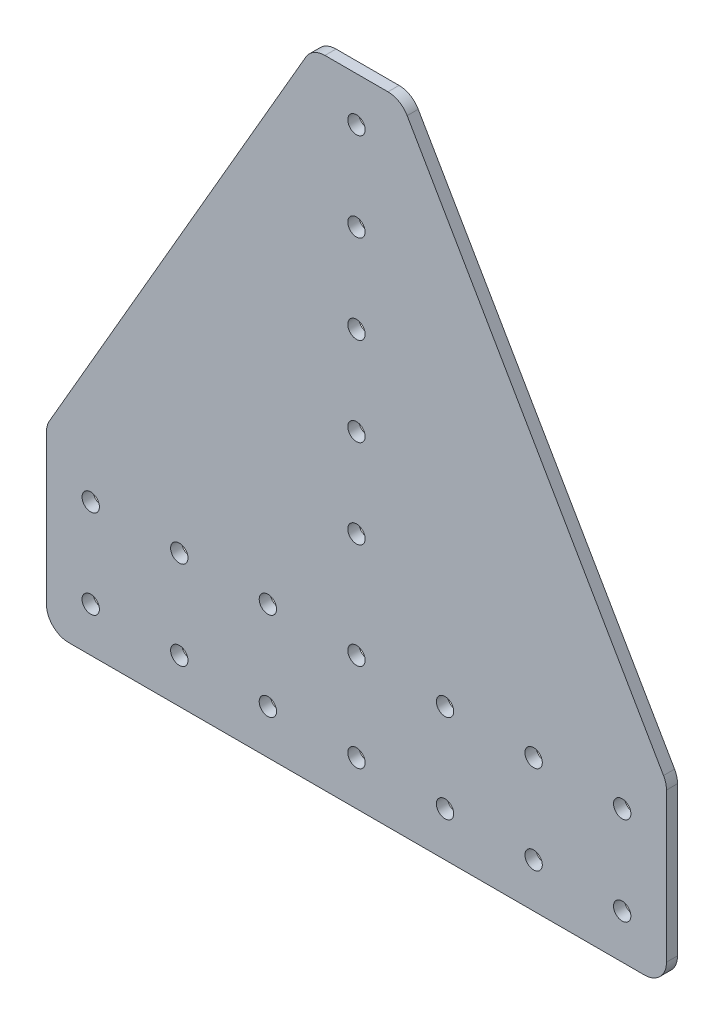
ISO-10303-21;
HEADER;
FILE_DESCRIPTION(('STEP AP214'),'2;1');
FILE_NAME('part.step','',(''),(''),'','','');
FILE_SCHEMA(('AUTOMOTIVE_DESIGN { 1 0 10303 214 1 1 1 1 }'));
ENDSEC;
DATA;
#1=APPLICATION_CONTEXT('core data for automotive mechanical design processes');
#2=APPLICATION_PROTOCOL_DEFINITION('international standard','automotive_design',2000,#1);
#3=PRODUCT_CONTEXT('',#1,'mechanical');
#4=PRODUCT('Part','Part','',(#3));
#5=PRODUCT_RELATED_PRODUCT_CATEGORY('part','',(#4));
#6=PRODUCT_DEFINITION_FORMATION('','',#4);
#7=PRODUCT_DEFINITION_CONTEXT('part definition',#1,'design');
#8=PRODUCT_DEFINITION('design','',#6,#7);
#9=PRODUCT_DEFINITION_SHAPE('','',#8);
#10=(LENGTH_UNIT() NAMED_UNIT(*) SI_UNIT(.MILLI.,.METRE.));
#11=(NAMED_UNIT(*) PLANE_ANGLE_UNIT() SI_UNIT($,.RADIAN.));
#12=(NAMED_UNIT(*) SI_UNIT($,.STERADIAN.) SOLID_ANGLE_UNIT());
#13=UNCERTAINTY_MEASURE_WITH_UNIT(LENGTH_MEASURE(1.E-05),#10,'distance_accuracy_value','');
#14=(GEOMETRIC_REPRESENTATION_CONTEXT(3) GLOBAL_UNCERTAINTY_ASSIGNED_CONTEXT((#13)) GLOBAL_UNIT_ASSIGNED_CONTEXT((#10,
#11,#12)) REPRESENTATION_CONTEXT('',''));
#15=CARTESIAN_POINT('',(0.,0.,0.));
#16=DIRECTION('',(0.,0.,1.));
#17=DIRECTION('',(1.,0.,0.));
#18=AXIS2_PLACEMENT_3D('',#15,#16,#17);
#19=CARTESIAN_POINT('',(0.,0.,-3.175));
#20=DIRECTION('',(1.,0.,0.));
#21=DIRECTION('',(0.,0.,-1.));
#22=AXIS2_PLACEMENT_3D('',#19,#20,#21);
#23=PLANE('',#22);
#24=DIRECTION('',(0.,1.,0.));
#25=VECTOR('',#24,1.);
#26=CARTESIAN_POINT('',(0.,0.,-3.175));
#27=LINE('',#26,#25);
#28=CARTESIAN_POINT('',(0.,6.35,-3.175));
#29=VERTEX_POINT('',#28);
#30=CARTESIAN_POINT('',(0.,49.0960656723805,-3.175));
#31=VERTEX_POINT('',#30);
#32=EDGE_CURVE('E157',#29,#31,#27,.T.);
#33=ORIENTED_EDGE('',*,*,#32,.F.);
#34=DIRECTION('',(0.,0.,1.));
#35=VECTOR('',#34,1.);
#36=CARTESIAN_POINT('',(0.,6.35,-3.175));
#37=LINE('',#36,#35);
#38=CARTESIAN_POINT('',(0.,6.35,0.));
#39=VERTEX_POINT('',#38);
#40=EDGE_CURVE('E141',#29,#39,#37,.T.);
#41=ORIENTED_EDGE('',*,*,#40,.T.);
#42=DIRECTION('',(0.,1.,0.));
#43=VECTOR('',#42,1.);
#44=CARTESIAN_POINT('',(0.,0.,0.));
#45=LINE('',#44,#43);
#46=CARTESIAN_POINT('',(0.,49.0960656723805,0.));
#47=VERTEX_POINT('',#46);
#48=EDGE_CURVE('E154',#39,#47,#45,.T.);
#49=ORIENTED_EDGE('',*,*,#48,.T.);
#50=DIRECTION('',(0.,0.,1.));
#51=VECTOR('',#50,1.);
#52=CARTESIAN_POINT('',(0.,49.0960656723805,-3.175));
#53=LINE('',#52,#51);
#54=EDGE_CURVE('E160',#47,#31,#53,.F.);
#55=ORIENTED_EDGE('',*,*,#54,.T.);
#56=EDGE_LOOP('',(#33,#41,#49,#55));
#57=FACE_BOUND('',#56,.T.);
#58=ADVANCED_FACE('F45',(#57),#23,.F.);
#59=CARTESIAN_POINT('',(0.,50.8,-3.175));
#60=DIRECTION('',(0.865664209780224,-0.500625085174105,0.));
#61=DIRECTION('',(0.500625085174106,0.865664209780224,0.));
#62=AXIS2_PLACEMENT_3D('',#59,#60,#61);
#63=PLANE('',#62);
#64=DIRECTION('',(0.500625085174106,0.865664209780224,0.));
#65=VECTOR('',#64,1.);
#66=CARTESIAN_POINT('',(0.,50.8,-3.175));
#67=LINE('',#66,#65);
#68=CARTESIAN_POINT('',(0.853032267895577,52.2750349632361,-3.175));
#69=VERTEX_POINT('',#68);
#70=CARTESIAN_POINT('',(74.3661509151936,179.391469290856,-3.175));
#71=VERTEX_POINT('',#70);
#72=EDGE_CURVE('E255',#69,#71,#67,.T.);
#73=ORIENTED_EDGE('',*,*,#72,.F.);
#74=DIRECTION('',(0.,0.,1.));
#75=VECTOR('',#74,1.);
#76=CARTESIAN_POINT('',(0.853032267895577,52.2750349632361,-3.175));
#77=LINE('',#76,#75);
#78=CARTESIAN_POINT('',(0.853032267895577,52.2750349632361,0.));
#79=VERTEX_POINT('',#78);
#80=EDGE_CURVE('E11',#69,#79,#77,.T.);
#81=ORIENTED_EDGE('',*,*,#80,.T.);
#82=DIRECTION('',(0.500625085174106,0.865664209780224,0.));
#83=VECTOR('',#82,1.);
#84=CARTESIAN_POINT('',(0.,50.8,0.));
#85=LINE('',#84,#83);
#86=CARTESIAN_POINT('',(74.3661509151936,179.391469290856,0.));
#87=VERTEX_POINT('',#86);
#88=EDGE_CURVE('E166',#79,#87,#85,.T.);
#89=ORIENTED_EDGE('',*,*,#88,.T.);
#90=DIRECTION('',(0.,0.,1.));
#91=VECTOR('',#90,1.);
#92=CARTESIAN_POINT('',(74.3661509151936,179.391469290856,-3.175));
#93=LINE('',#92,#91);
#94=EDGE_CURVE('E54',#87,#71,#93,.F.);
#95=ORIENTED_EDGE('',*,*,#94,.T.);
#96=EDGE_LOOP('',(#73,#81,#89,#95));
#97=FACE_BOUND('',#96,.T.);
#98=ADVANCED_FACE('F254',(#97),#63,.F.);
#99=CARTESIAN_POINT('',(76.2,182.5625,-3.175));
#100=DIRECTION('',(0.,-1.,0.));
#101=DIRECTION('',(0.,0.,-1.));
#102=AXIS2_PLACEMENT_3D('',#99,#100,#101);
#103=PLANE('',#102);
#104=DIRECTION('',(1.,0.,0.));
#105=VECTOR('',#104,1.);
#106=CARTESIAN_POINT('',(76.2,182.5625,0.));
#107=LINE('',#106,#105);
#108=CARTESIAN_POINT('',(79.863118647298,182.5625,0.));
#109=VERTEX_POINT('',#108);
#110=CARTESIAN_POINT('',(97.936881352702,182.5625,0.));
#111=VERTEX_POINT('',#110);
#112=EDGE_CURVE('E172',#109,#111,#107,.T.);
#113=ORIENTED_EDGE('',*,*,#112,.T.);
#114=DIRECTION('',(0.,0.,1.));
#115=VECTOR('',#114,1.);
#116=CARTESIAN_POINT('',(97.936881352702,182.5625,-3.175));
#117=LINE('',#116,#115);
#118=CARTESIAN_POINT('',(97.936881352702,182.5625,-3.175));
#119=VERTEX_POINT('',#118);
#120=EDGE_CURVE('E247',#111,#119,#117,.F.);
#121=ORIENTED_EDGE('',*,*,#120,.T.);
#122=DIRECTION('',(1.,0.,0.));
#123=VECTOR('',#122,1.);
#124=CARTESIAN_POINT('',(76.2,182.5625,-3.175));
#125=LINE('',#124,#123);
#126=CARTESIAN_POINT('',(79.863118647298,182.5625,-3.175));
#127=VERTEX_POINT('',#126);
#128=EDGE_CURVE('E265',#127,#119,#125,.T.);
#129=ORIENTED_EDGE('',*,*,#128,.F.);
#130=DIRECTION('',(0.,0.,1.));
#131=VECTOR('',#130,1.);
#132=CARTESIAN_POINT('',(79.863118647298,182.5625,-3.175));
#133=LINE('',#132,#131);
#134=EDGE_CURVE('E243',#127,#109,#133,.T.);
#135=ORIENTED_EDGE('',*,*,#134,.T.);
#136=EDGE_LOOP('',(#113,#121,#129,#135));
#137=FACE_BOUND('',#136,.T.);
#138=ADVANCED_FACE('F270',(#137),#103,.F.);
#139=CARTESIAN_POINT('',(101.6,182.5625,-3.175));
#140=DIRECTION('',(-0.865664209780224,-0.500625085174105,0.));
#141=DIRECTION('',(0.500625085174105,-0.865664209780224,0.));
#142=AXIS2_PLACEMENT_3D('',#139,#140,#141);
#143=PLANE('',#142);
#144=DIRECTION('',(0.500625085174105,-0.865664209780224,0.));
#145=VECTOR('',#144,1.);
#146=CARTESIAN_POINT('',(101.6,182.5625,0.));
#147=LINE('',#146,#145);
#148=CARTESIAN_POINT('',(103.433849084806,179.391469290856,0.));
#149=VERTEX_POINT('',#148);
#150=CARTESIAN_POINT('',(176.946967732104,52.2750349632361,0.));
#151=VERTEX_POINT('',#150);
#152=EDGE_CURVE('E184',#149,#151,#147,.T.);
#153=ORIENTED_EDGE('',*,*,#152,.T.);
#154=DIRECTION('',(0.,0.,1.));
#155=VECTOR('',#154,1.);
#156=CARTESIAN_POINT('',(176.946967732104,52.2750349632361,-3.175));
#157=LINE('',#156,#155);
#158=CARTESIAN_POINT('',(176.946967732104,52.2750349632361,-3.175));
#159=VERTEX_POINT('',#158);
#160=EDGE_CURVE('E240',#151,#159,#157,.F.);
#161=ORIENTED_EDGE('',*,*,#160,.T.);
#162=DIRECTION('',(0.500625085174105,-0.865664209780224,0.));
#163=VECTOR('',#162,1.);
#164=CARTESIAN_POINT('',(101.6,182.5625,-3.175));
#165=LINE('',#164,#163);
#166=CARTESIAN_POINT('',(103.433849084806,179.391469290856,-3.175));
#167=VERTEX_POINT('',#166);
#168=EDGE_CURVE('E281',#167,#159,#165,.T.);
#169=ORIENTED_EDGE('',*,*,#168,.F.);
#170=DIRECTION('',(0.,0.,1.));
#171=VECTOR('',#170,1.);
#172=CARTESIAN_POINT('',(103.433849084806,179.391469290856,-3.175));
#173=LINE('',#172,#171);
#174=EDGE_CURVE('E236',#167,#149,#173,.T.);
#175=ORIENTED_EDGE('',*,*,#174,.T.);
#176=EDGE_LOOP('',(#153,#161,#169,#175));
#177=FACE_BOUND('',#176,.T.);
#178=ADVANCED_FACE('F279',(#177),#143,.F.);
#179=CARTESIAN_POINT('',(177.8,50.8,-3.175));
#180=DIRECTION('',(-1.,0.,0.));
#181=DIRECTION('',(0.,0.,1.));
#182=AXIS2_PLACEMENT_3D('',#179,#180,#181);
#183=PLANE('',#182);
#184=DIRECTION('',(0.,-1.,0.));
#185=VECTOR('',#184,1.);
#186=CARTESIAN_POINT('',(177.8,50.8,0.));
#187=LINE('',#186,#185);
#188=CARTESIAN_POINT('',(177.8,49.0960656723805,0.));
#189=VERTEX_POINT('',#188);
#190=CARTESIAN_POINT('',(177.8,6.34999999999999,0.));
#191=VERTEX_POINT('',#190);
#192=EDGE_CURVE('E188',#189,#191,#187,.T.);
#193=ORIENTED_EDGE('',*,*,#192,.T.);
#194=DIRECTION('',(0.,0.,1.));
#195=VECTOR('',#194,1.);
#196=CARTESIAN_POINT('',(177.8,6.34999999999999,-3.175));
#197=LINE('',#196,#195);
#198=CARTESIAN_POINT('',(177.8,6.34999999999999,-3.175));
#199=VERTEX_POINT('',#198);
#200=EDGE_CURVE('E61',#191,#199,#197,.F.);
#201=ORIENTED_EDGE('',*,*,#200,.T.);
#202=DIRECTION('',(0.,-1.,0.));
#203=VECTOR('',#202,1.);
#204=CARTESIAN_POINT('',(177.8,50.8,-3.175));
#205=LINE('',#204,#203);
#206=CARTESIAN_POINT('',(177.8,49.0960656723805,-3.175));
#207=VERTEX_POINT('',#206);
#208=EDGE_CURVE('E283',#207,#199,#205,.T.);
#209=ORIENTED_EDGE('',*,*,#208,.F.);
#210=DIRECTION('',(0.,0.,1.));
#211=VECTOR('',#210,1.);
#212=CARTESIAN_POINT('',(177.8,49.0960656723805,-3.175));
#213=LINE('',#212,#211);
#214=EDGE_CURVE('E230',#207,#189,#213,.T.);
#215=ORIENTED_EDGE('',*,*,#214,.T.);
#216=EDGE_LOOP('',(#193,#201,#209,#215));
#217=FACE_BOUND('',#216,.T.);
#218=ADVANCED_FACE('F496',(#217),#183,.F.);
#219=CARTESIAN_POINT('',(177.8,0.,-3.175));
#220=DIRECTION('',(0.,1.,0.));
#221=DIRECTION('',(-1.,0.,0.));
#222=AXIS2_PLACEMENT_3D('',#219,#220,#221);
#223=PLANE('',#222);
#224=DIRECTION('',(-1.,0.,0.));
#225=VECTOR('',#224,1.);
#226=CARTESIAN_POINT('',(177.8,0.,0.));
#227=LINE('',#226,#225);
#228=CARTESIAN_POINT('',(171.45,0.,0.));
#229=VERTEX_POINT('',#228);
#230=CARTESIAN_POINT('',(6.34999999999999,0.,0.));
#231=VERTEX_POINT('',#230);
#232=EDGE_CURVE('E191',#229,#231,#227,.T.);
#233=ORIENTED_EDGE('',*,*,#232,.T.);
#234=DIRECTION('',(0.,0.,1.));
#235=VECTOR('',#234,1.);
#236=CARTESIAN_POINT('',(6.34999999999999,0.,-3.175));
#237=LINE('',#236,#235);
#238=CARTESIAN_POINT('',(6.34999999999999,0.,-3.175));
#239=VERTEX_POINT('',#238);
#240=EDGE_CURVE('E142',#231,#239,#237,.F.);
#241=ORIENTED_EDGE('',*,*,#240,.T.);
#242=DIRECTION('',(-1.,0.,0.));
#243=VECTOR('',#242,1.);
#244=CARTESIAN_POINT('',(177.8,0.,-3.175));
#245=LINE('',#244,#243);
#246=CARTESIAN_POINT('',(171.45,0.,-3.175));
#247=VERTEX_POINT('',#246);
#248=EDGE_CURVE('E178',#247,#239,#245,.T.);
#249=ORIENTED_EDGE('',*,*,#248,.F.);
#250=DIRECTION('',(0.,0.,1.));
#251=VECTOR('',#250,1.);
#252=CARTESIAN_POINT('',(171.45,0.,-3.175));
#253=LINE('',#252,#251);
#254=EDGE_CURVE('E148',#247,#229,#253,.T.);
#255=ORIENTED_EDGE('',*,*,#254,.T.);
#256=EDGE_LOOP('',(#233,#241,#249,#255));
#257=FACE_BOUND('',#256,.T.);
#258=ADVANCED_FACE('F494',(#257),#223,.F.);
#259=CARTESIAN_POINT('',(0.,0.,-3.175));
#260=DIRECTION('',(0.,0.,-1.));
#261=DIRECTION('',(-1.,0.,0.));
#262=AXIS2_PLACEMENT_3D('',#259,#260,#261);
#263=PLANE('',#262);
#264=CARTESIAN_POINT('',(63.5,38.1,-3.175));
#265=DIRECTION('',(0.,0.,1.));
#266=DIRECTION('',(1.,0.,0.));
#267=AXIS2_PLACEMENT_3D('',#264,#265,#266);
#268=CIRCLE('',#267,2.4892);
#269=CARTESIAN_POINT('',(65.9892,38.1,-3.175));
#270=VERTEX_POINT('',#269);
#271=EDGE_CURVE('E384',#270,#270,#268,.T.);
#272=ORIENTED_EDGE('',*,*,#271,.T.);
#273=EDGE_LOOP('',(#272));
#274=FACE_BOUND('',#273,.T.);
#275=CARTESIAN_POINT('',(88.9,38.1,-3.175));
#276=DIRECTION('',(0.,0.,1.));
#277=DIRECTION('',(1.,0.,0.));
#278=AXIS2_PLACEMENT_3D('',#275,#276,#277);
#279=CIRCLE('',#278,2.48919999999999);
#280=CARTESIAN_POINT('',(91.3892,38.1,-3.175));
#281=VERTEX_POINT('',#280);
#282=EDGE_CURVE('E376',#281,#281,#279,.T.);
#283=ORIENTED_EDGE('',*,*,#282,.T.);
#284=EDGE_LOOP('',(#283));
#285=FACE_BOUND('',#284,.T.);
#286=CARTESIAN_POINT('',(114.3,38.1,-3.175));
#287=DIRECTION('',(0.,0.,1.));
#288=DIRECTION('',(1.,0.,0.));
#289=AXIS2_PLACEMENT_3D('',#286,#287,#288);
#290=CIRCLE('',#289,2.4892);
#291=CARTESIAN_POINT('',(116.7892,38.1,-3.175));
#292=VERTEX_POINT('',#291);
#293=EDGE_CURVE('E368',#292,#292,#290,.T.);
#294=ORIENTED_EDGE('',*,*,#293,.T.);
#295=EDGE_LOOP('',(#294));
#296=FACE_BOUND('',#295,.T.);
#297=CARTESIAN_POINT('',(139.7,38.1,-3.175));
#298=DIRECTION('',(0.,0.,1.));
#299=DIRECTION('',(1.,0.,0.));
#300=AXIS2_PLACEMENT_3D('',#297,#298,#299);
#301=CIRCLE('',#300,2.4892);
#302=CARTESIAN_POINT('',(142.1892,38.1,-3.175));
#303=VERTEX_POINT('',#302);
#304=EDGE_CURVE('E359',#303,#303,#301,.T.);
#305=ORIENTED_EDGE('',*,*,#304,.T.);
#306=EDGE_LOOP('',(#305));
#307=FACE_BOUND('',#306,.T.);
#308=CARTESIAN_POINT('',(165.1,38.1,-3.175));
#309=DIRECTION('',(0.,0.,1.));
#310=DIRECTION('',(1.,0.,0.));
#311=AXIS2_PLACEMENT_3D('',#308,#309,#310);
#312=CIRCLE('',#311,2.4892);
#313=CARTESIAN_POINT('',(167.5892,38.1,-3.175));
#314=VERTEX_POINT('',#313);
#315=EDGE_CURVE('E416',#314,#314,#312,.T.);
#316=ORIENTED_EDGE('',*,*,#315,.T.);
#317=EDGE_LOOP('',(#316));
#318=FACE_BOUND('',#317,.T.);
#319=CARTESIAN_POINT('',(12.7,38.1,-3.175));
#320=DIRECTION('',(0.,0.,1.));
#321=DIRECTION('',(1.,0.,0.));
#322=AXIS2_PLACEMENT_3D('',#319,#320,#321);
#323=CIRCLE('',#322,2.4892);
#324=CARTESIAN_POINT('',(15.1892,38.1,-3.175));
#325=VERTEX_POINT('',#324);
#326=EDGE_CURVE('E408',#325,#325,#323,.T.);
#327=ORIENTED_EDGE('',*,*,#326,.T.);
#328=EDGE_LOOP('',(#327));
#329=FACE_BOUND('',#328,.T.);
#330=CARTESIAN_POINT('',(88.9,144.4625,-3.175));
#331=DIRECTION('',(0.,0.,1.));
#332=DIRECTION('',(1.,0.,0.));
#333=AXIS2_PLACEMENT_3D('',#330,#331,#332);
#334=CIRCLE('',#333,2.48920000000001);
#335=CARTESIAN_POINT('',(91.3892,144.4625,-3.175));
#336=VERTEX_POINT('',#335);
#337=EDGE_CURVE('E400',#336,#336,#334,.T.);
#338=ORIENTED_EDGE('',*,*,#337,.T.);
#339=EDGE_LOOP('',(#338));
#340=FACE_BOUND('',#339,.T.);
#341=CARTESIAN_POINT('',(88.9,119.0625,-3.175));
#342=DIRECTION('',(0.,0.,1.));
#343=DIRECTION('',(1.,0.,0.));
#344=AXIS2_PLACEMENT_3D('',#341,#342,#343);
#345=CIRCLE('',#344,2.48920000000001);
#346=CARTESIAN_POINT('',(91.3892,119.0625,-3.175));
#347=VERTEX_POINT('',#346);
#348=EDGE_CURVE('E391',#347,#347,#345,.T.);
#349=ORIENTED_EDGE('',*,*,#348,.T.);
#350=EDGE_LOOP('',(#349));
#351=FACE_BOUND('',#350,.T.);
#352=CARTESIAN_POINT('',(88.9,12.7,-3.175));
#353=DIRECTION('',(0.,0.,1.));
#354=DIRECTION('',(1.,0.,0.));
#355=AXIS2_PLACEMENT_3D('',#352,#353,#354);
#356=CIRCLE('',#355,2.48919999999999);
#357=CARTESIAN_POINT('',(91.3892,12.7,-3.175));
#358=VERTEX_POINT('',#357);
#359=EDGE_CURVE('E311',#358,#358,#356,.T.);
#360=ORIENTED_EDGE('',*,*,#359,.T.);
#361=EDGE_LOOP('',(#360));
#362=FACE_BOUND('',#361,.T.);
#363=CARTESIAN_POINT('',(63.5,12.7,-3.175));
#364=DIRECTION('',(0.,0.,1.));
#365=DIRECTION('',(1.,0.,0.));
#366=AXIS2_PLACEMENT_3D('',#363,#364,#365);
#367=CIRCLE('',#366,2.4892);
#368=CARTESIAN_POINT('',(65.9892,12.7,-3.175));
#369=VERTEX_POINT('',#368);
#370=EDGE_CURVE('E320',#369,#369,#367,.T.);
#371=ORIENTED_EDGE('',*,*,#370,.T.);
#372=EDGE_LOOP('',(#371));
#373=FACE_BOUND('',#372,.T.);
#374=CARTESIAN_POINT('',(38.1,12.7,-3.175));
#375=DIRECTION('',(0.,0.,1.));
#376=DIRECTION('',(1.,0.,0.));
#377=AXIS2_PLACEMENT_3D('',#374,#375,#376);
#378=CIRCLE('',#377,2.4892);
#379=CARTESIAN_POINT('',(40.5892,12.7,-3.175));
#380=VERTEX_POINT('',#379);
#381=EDGE_CURVE('E295',#380,#380,#378,.T.);
#382=ORIENTED_EDGE('',*,*,#381,.T.);
#383=EDGE_LOOP('',(#382));
#384=FACE_BOUND('',#383,.T.);
#385=CARTESIAN_POINT('',(88.9,169.8625,-3.175));
#386=DIRECTION('',(0.,0.,1.));
#387=DIRECTION('',(1.,0.,0.));
#388=AXIS2_PLACEMENT_3D('',#385,#386,#387);
#389=CIRCLE('',#388,2.48920000000001);
#390=CARTESIAN_POINT('',(91.3892,169.8625,-3.175));
#391=VERTEX_POINT('',#390);
#392=EDGE_CURVE('E304',#391,#391,#389,.T.);
#393=ORIENTED_EDGE('',*,*,#392,.T.);
#394=EDGE_LOOP('',(#393));
#395=FACE_BOUND('',#394,.T.);
#396=CARTESIAN_POINT('',(38.1,38.1,-3.175));
#397=DIRECTION('',(0.,0.,1.));
#398=DIRECTION('',(1.,0.,0.));
#399=AXIS2_PLACEMENT_3D('',#396,#397,#398);
#400=CIRCLE('',#399,2.4892);
#401=CARTESIAN_POINT('',(40.5892,38.1,-3.175));
#402=VERTEX_POINT('',#401);
#403=EDGE_CURVE('E343',#402,#402,#400,.T.);
#404=ORIENTED_EDGE('',*,*,#403,.T.);
#405=EDGE_LOOP('',(#404));
#406=FACE_BOUND('',#405,.T.);
#407=CARTESIAN_POINT('',(165.1,12.7,-3.175));
#408=DIRECTION('',(0.,0.,1.));
#409=DIRECTION('',(1.,0.,0.));
#410=AXIS2_PLACEMENT_3D('',#407,#408,#409);
#411=CIRCLE('',#410,2.4892);
#412=CARTESIAN_POINT('',(167.5892,12.7,-3.175));
#413=VERTEX_POINT('',#412);
#414=EDGE_CURVE('E352',#413,#413,#411,.T.);
#415=ORIENTED_EDGE('',*,*,#414,.T.);
#416=EDGE_LOOP('',(#415));
#417=FACE_BOUND('',#416,.T.);
#418=CARTESIAN_POINT('',(139.7,12.7,-3.175));
#419=DIRECTION('',(0.,0.,1.));
#420=DIRECTION('',(1.,0.,0.));
#421=AXIS2_PLACEMENT_3D('',#418,#419,#420);
#422=CIRCLE('',#421,2.4892);
#423=CARTESIAN_POINT('',(142.1892,12.7,-3.175));
#424=VERTEX_POINT('',#423);
#425=EDGE_CURVE('E327',#424,#424,#422,.T.);
#426=ORIENTED_EDGE('',*,*,#425,.T.);
#427=EDGE_LOOP('',(#426));
#428=FACE_BOUND('',#427,.T.);
#429=CARTESIAN_POINT('',(114.3,12.7,-3.175));
#430=DIRECTION('',(0.,0.,1.));
#431=DIRECTION('',(1.,0.,0.));
#432=AXIS2_PLACEMENT_3D('',#429,#430,#431);
#433=CIRCLE('',#432,2.4892);
#434=CARTESIAN_POINT('',(116.7892,12.7,-3.175));
#435=VERTEX_POINT('',#434);
#436=EDGE_CURVE('E336',#435,#435,#433,.T.);
#437=ORIENTED_EDGE('',*,*,#436,.T.);
#438=EDGE_LOOP('',(#437));
#439=FACE_BOUND('',#438,.T.);
#440=CARTESIAN_POINT('',(88.9,93.6625,-3.175));
#441=DIRECTION('',(0.,0.,1.));
#442=DIRECTION('',(1.,0.,0.));
#443=AXIS2_PLACEMENT_3D('',#440,#441,#442);
#444=CIRCLE('',#443,2.48920000000001);
#445=CARTESIAN_POINT('',(91.3892,93.6625,-3.175));
#446=VERTEX_POINT('',#445);
#447=EDGE_CURVE('E431',#446,#446,#444,.T.);
#448=ORIENTED_EDGE('',*,*,#447,.T.);
#449=EDGE_LOOP('',(#448));
#450=FACE_BOUND('',#449,.T.);
#451=CARTESIAN_POINT('',(88.9,68.2625,-3.175));
#452=DIRECTION('',(0.,0.,1.));
#453=DIRECTION('',(1.,0.,0.));
#454=AXIS2_PLACEMENT_3D('',#451,#452,#453);
#455=CIRCLE('',#454,2.48920000000001);
#456=CARTESIAN_POINT('',(91.3892,68.2625,-3.175));
#457=VERTEX_POINT('',#456);
#458=EDGE_CURVE('E423',#457,#457,#455,.T.);
#459=ORIENTED_EDGE('',*,*,#458,.T.);
#460=EDGE_LOOP('',(#459));
#461=FACE_BOUND('',#460,.T.);
#462=CARTESIAN_POINT('',(12.7,12.7,-3.175));
#463=DIRECTION('',(0.,0.,1.));
#464=DIRECTION('',(1.,0.,0.));
#465=AXIS2_PLACEMENT_3D('',#462,#463,#464);
#466=CIRCLE('',#465,2.4892);
#467=CARTESIAN_POINT('',(15.1892,12.7,-3.175));
#468=VERTEX_POINT('',#467);
#469=EDGE_CURVE('E167',#468,#468,#466,.T.);
#470=ORIENTED_EDGE('',*,*,#469,.T.);
#471=EDGE_LOOP('',(#470));
#472=FACE_BOUND('',#471,.T.);
#473=ORIENTED_EDGE('',*,*,#248,.T.);
#474=CARTESIAN_POINT('',(6.35,6.35,-3.175));
#475=DIRECTION('',(0.,0.,-1.));
#476=DIRECTION('',(-1.,0.,0.));
#477=AXIS2_PLACEMENT_3D('',#474,#475,#476);
#478=CIRCLE('',#477,6.35);
#479=EDGE_CURVE('E227',#239,#29,#478,.T.);
#480=ORIENTED_EDGE('',*,*,#479,.T.);
#481=ORIENTED_EDGE('',*,*,#32,.T.);
#482=CARTESIAN_POINT('',(6.35,49.0960656723805,-3.175));
#483=DIRECTION('',(0.,0.,-1.));
#484=DIRECTION('',(-1.,0.,0.));
#485=AXIS2_PLACEMENT_3D('',#482,#483,#484);
#486=CIRCLE('',#485,6.35);
#487=EDGE_CURVE('E216',#31,#69,#486,.T.);
#488=ORIENTED_EDGE('',*,*,#487,.T.);
#489=ORIENTED_EDGE('',*,*,#72,.T.);
#490=CARTESIAN_POINT('',(79.863118647298,176.2125,-3.175));
#491=DIRECTION('',(0.,0.,-1.));
#492=DIRECTION('',(-1.,0.,0.));
#493=AXIS2_PLACEMENT_3D('',#490,#491,#492);
#494=CIRCLE('',#493,6.35);
#495=EDGE_CURVE('E213',#71,#127,#494,.T.);
#496=ORIENTED_EDGE('',*,*,#495,.T.);
#497=ORIENTED_EDGE('',*,*,#128,.T.);
#498=CARTESIAN_POINT('',(97.936881352702,176.2125,-3.175));
#499=DIRECTION('',(0.,0.,-1.));
#500=DIRECTION('',(-1.,0.,0.));
#501=AXIS2_PLACEMENT_3D('',#498,#499,#500);
#502=CIRCLE('',#501,6.35);
#503=EDGE_CURVE('E219',#119,#167,#502,.T.);
#504=ORIENTED_EDGE('',*,*,#503,.T.);
#505=ORIENTED_EDGE('',*,*,#168,.T.);
#506=CARTESIAN_POINT('',(171.45,49.0960656723805,-3.175));
#507=DIRECTION('',(0.,0.,-1.));
#508=DIRECTION('',(-1.,0.,0.));
#509=AXIS2_PLACEMENT_3D('',#506,#507,#508);
#510=CIRCLE('',#509,6.35);
#511=EDGE_CURVE('E68',#159,#207,#510,.T.);
#512=ORIENTED_EDGE('',*,*,#511,.T.);
#513=ORIENTED_EDGE('',*,*,#208,.T.);
#514=CARTESIAN_POINT('',(171.45,6.35,-3.175));
#515=DIRECTION('',(0.,0.,-1.));
#516=DIRECTION('',(-1.,0.,0.));
#517=AXIS2_PLACEMENT_3D('',#514,#515,#516);
#518=CIRCLE('',#517,6.35);
#519=EDGE_CURVE('E224',#199,#247,#518,.T.);
#520=ORIENTED_EDGE('',*,*,#519,.T.);
#521=EDGE_LOOP('',(#473,#480,#481,#488,#489,#496,#497,#504,#505,#512,#513,#520));
#522=FACE_BOUND('',#521,.T.);
#523=ADVANCED_FACE('F260',(#274,#285,#296,#307,#318,#329,#340,#351,#362,#373,#384,#395,#406,
#417,#428,#439,#450,#461,#472,#522),#263,.T.);
#524=CARTESIAN_POINT('',(0.,0.,0.));
#525=DIRECTION('',(0.,0.,-1.));
#526=DIRECTION('',(-1.,0.,0.));
#527=AXIS2_PLACEMENT_3D('',#524,#525,#526);
#528=PLANE('',#527);
#529=CARTESIAN_POINT('',(63.5,38.1,0.));
#530=DIRECTION('',(0.,0.,1.));
#531=DIRECTION('',(1.,0.,0.));
#532=AXIS2_PLACEMENT_3D('',#529,#530,#531);
#533=CIRCLE('',#532,2.4892);
#534=CARTESIAN_POINT('',(65.9892,38.1,0.));
#535=VERTEX_POINT('',#534);
#536=EDGE_CURVE('E348',#535,#535,#533,.T.);
#537=ORIENTED_EDGE('',*,*,#536,.F.);
#538=EDGE_LOOP('',(#537));
#539=FACE_BOUND('',#538,.T.);
#540=CARTESIAN_POINT('',(88.9,38.1,0.));
#541=DIRECTION('',(0.,0.,1.));
#542=DIRECTION('',(1.,0.,0.));
#543=AXIS2_PLACEMENT_3D('',#540,#541,#542);
#544=CIRCLE('',#543,2.48919999999999);
#545=CARTESIAN_POINT('',(91.3892,38.1,0.));
#546=VERTEX_POINT('',#545);
#547=EDGE_CURVE('E380',#546,#546,#544,.T.);
#548=ORIENTED_EDGE('',*,*,#547,.F.);
#549=EDGE_LOOP('',(#548));
#550=FACE_BOUND('',#549,.T.);
#551=CARTESIAN_POINT('',(114.3,38.1,0.));
#552=DIRECTION('',(0.,0.,1.));
#553=DIRECTION('',(1.,0.,0.));
#554=AXIS2_PLACEMENT_3D('',#551,#552,#553);
#555=CIRCLE('',#554,2.4892);
#556=CARTESIAN_POINT('',(116.7892,38.1,0.));
#557=VERTEX_POINT('',#556);
#558=EDGE_CURVE('E372',#557,#557,#555,.T.);
#559=ORIENTED_EDGE('',*,*,#558,.F.);
#560=EDGE_LOOP('',(#559));
#561=FACE_BOUND('',#560,.T.);
#562=CARTESIAN_POINT('',(139.7,38.1,0.));
#563=DIRECTION('',(0.,0.,1.));
#564=DIRECTION('',(1.,0.,0.));
#565=AXIS2_PLACEMENT_3D('',#562,#563,#564);
#566=CIRCLE('',#565,2.4892);
#567=CARTESIAN_POINT('',(142.1892,38.1,0.));
#568=VERTEX_POINT('',#567);
#569=EDGE_CURVE('E363',#568,#568,#566,.T.);
#570=ORIENTED_EDGE('',*,*,#569,.F.);
#571=EDGE_LOOP('',(#570));
#572=FACE_BOUND('',#571,.T.);
#573=CARTESIAN_POINT('',(165.1,38.1,0.));
#574=DIRECTION('',(0.,0.,1.));
#575=DIRECTION('',(1.,0.,0.));
#576=AXIS2_PLACEMENT_3D('',#573,#574,#575);
#577=CIRCLE('',#576,2.4892);
#578=CARTESIAN_POINT('',(167.5892,38.1,0.));
#579=VERTEX_POINT('',#578);
#580=EDGE_CURVE('E364',#579,#579,#577,.T.);
#581=ORIENTED_EDGE('',*,*,#580,.F.);
#582=EDGE_LOOP('',(#581));
#583=FACE_BOUND('',#582,.T.);
#584=CARTESIAN_POINT('',(12.7,38.1,0.));
#585=DIRECTION('',(0.,0.,1.));
#586=DIRECTION('',(1.,0.,0.));
#587=AXIS2_PLACEMENT_3D('',#584,#585,#586);
#588=CIRCLE('',#587,2.4892);
#589=CARTESIAN_POINT('',(15.1892,38.1,0.));
#590=VERTEX_POINT('',#589);
#591=EDGE_CURVE('E412',#590,#590,#588,.T.);
#592=ORIENTED_EDGE('',*,*,#591,.F.);
#593=EDGE_LOOP('',(#592));
#594=FACE_BOUND('',#593,.T.);
#595=CARTESIAN_POINT('',(88.9,144.4625,0.));
#596=DIRECTION('',(0.,0.,1.));
#597=DIRECTION('',(1.,0.,0.));
#598=AXIS2_PLACEMENT_3D('',#595,#596,#597);
#599=CIRCLE('',#598,2.48920000000001);
#600=CARTESIAN_POINT('',(91.3892,144.4625,0.));
#601=VERTEX_POINT('',#600);
#602=EDGE_CURVE('E404',#601,#601,#599,.T.);
#603=ORIENTED_EDGE('',*,*,#602,.F.);
#604=EDGE_LOOP('',(#603));
#605=FACE_BOUND('',#604,.T.);
#606=CARTESIAN_POINT('',(88.9,119.0625,0.));
#607=DIRECTION('',(0.,0.,1.));
#608=DIRECTION('',(1.,0.,0.));
#609=AXIS2_PLACEMENT_3D('',#606,#607,#608);
#610=CIRCLE('',#609,2.48920000000001);
#611=CARTESIAN_POINT('',(91.3892,119.0625,0.));
#612=VERTEX_POINT('',#611);
#613=EDGE_CURVE('E395',#612,#612,#610,.T.);
#614=ORIENTED_EDGE('',*,*,#613,.F.);
#615=EDGE_LOOP('',(#614));
#616=FACE_BOUND('',#615,.T.);
#617=CARTESIAN_POINT('',(88.9,12.7,0.));
#618=DIRECTION('',(0.,0.,1.));
#619=DIRECTION('',(1.,0.,0.));
#620=AXIS2_PLACEMENT_3D('',#617,#618,#619);
#621=CIRCLE('',#620,2.48919999999999);
#622=CARTESIAN_POINT('',(91.3892,12.7,0.));
#623=VERTEX_POINT('',#622);
#624=EDGE_CURVE('E315',#623,#623,#621,.T.);
#625=ORIENTED_EDGE('',*,*,#624,.F.);
#626=EDGE_LOOP('',(#625));
#627=FACE_BOUND('',#626,.T.);
#628=CARTESIAN_POINT('',(63.5,12.7,0.));
#629=DIRECTION('',(0.,0.,1.));
#630=DIRECTION('',(1.,0.,0.));
#631=AXIS2_PLACEMENT_3D('',#628,#629,#630);
#632=CIRCLE('',#631,2.4892);
#633=CARTESIAN_POINT('',(65.9892,12.7,0.));
#634=VERTEX_POINT('',#633);
#635=EDGE_CURVE('E300',#634,#634,#632,.T.);
#636=ORIENTED_EDGE('',*,*,#635,.F.);
#637=EDGE_LOOP('',(#636));
#638=FACE_BOUND('',#637,.T.);
#639=CARTESIAN_POINT('',(38.1,12.7,0.));
#640=DIRECTION('',(0.,0.,1.));
#641=DIRECTION('',(1.,0.,0.));
#642=AXIS2_PLACEMENT_3D('',#639,#640,#641);
#643=CIRCLE('',#642,2.4892);
#644=CARTESIAN_POINT('',(40.5892,12.7,0.));
#645=VERTEX_POINT('',#644);
#646=EDGE_CURVE('E299',#645,#645,#643,.T.);
#647=ORIENTED_EDGE('',*,*,#646,.F.);
#648=EDGE_LOOP('',(#647));
#649=FACE_BOUND('',#648,.T.);
#650=CARTESIAN_POINT('',(88.9,169.8625,0.));
#651=DIRECTION('',(0.,0.,1.));
#652=DIRECTION('',(1.,0.,0.));
#653=AXIS2_PLACEMENT_3D('',#650,#651,#652);
#654=CIRCLE('',#653,2.48920000000001);
#655=CARTESIAN_POINT('',(91.3892,169.8625,0.));
#656=VERTEX_POINT('',#655);
#657=EDGE_CURVE('E293',#656,#656,#654,.T.);
#658=ORIENTED_EDGE('',*,*,#657,.F.);
#659=EDGE_LOOP('',(#658));
#660=FACE_BOUND('',#659,.T.);
#661=CARTESIAN_POINT('',(38.1,38.1,0.));
#662=DIRECTION('',(0.,0.,1.));
#663=DIRECTION('',(1.,0.,0.));
#664=AXIS2_PLACEMENT_3D('',#661,#662,#663);
#665=CIRCLE('',#664,2.4892);
#666=CARTESIAN_POINT('',(40.5892,38.1,0.));
#667=VERTEX_POINT('',#666);
#668=EDGE_CURVE('E347',#667,#667,#665,.T.);
#669=ORIENTED_EDGE('',*,*,#668,.F.);
#670=EDGE_LOOP('',(#669));
#671=FACE_BOUND('',#670,.T.);
#672=CARTESIAN_POINT('',(165.1,12.7,0.));
#673=DIRECTION('',(0.,0.,1.));
#674=DIRECTION('',(1.,0.,0.));
#675=AXIS2_PLACEMENT_3D('',#672,#673,#674);
#676=CIRCLE('',#675,2.4892);
#677=CARTESIAN_POINT('',(167.5892,12.7,0.));
#678=VERTEX_POINT('',#677);
#679=EDGE_CURVE('E332',#678,#678,#676,.T.);
#680=ORIENTED_EDGE('',*,*,#679,.F.);
#681=EDGE_LOOP('',(#680));
#682=FACE_BOUND('',#681,.T.);
#683=CARTESIAN_POINT('',(139.7,12.7,0.));
#684=DIRECTION('',(0.,0.,1.));
#685=DIRECTION('',(1.,0.,0.));
#686=AXIS2_PLACEMENT_3D('',#683,#684,#685);
#687=CIRCLE('',#686,2.4892);
#688=CARTESIAN_POINT('',(142.1892,12.7,0.));
#689=VERTEX_POINT('',#688);
#690=EDGE_CURVE('E331',#689,#689,#687,.T.);
#691=ORIENTED_EDGE('',*,*,#690,.F.);
#692=EDGE_LOOP('',(#691));
#693=FACE_BOUND('',#692,.T.);
#694=CARTESIAN_POINT('',(114.3,12.7,0.));
#695=DIRECTION('',(0.,0.,1.));
#696=DIRECTION('',(1.,0.,0.));
#697=AXIS2_PLACEMENT_3D('',#694,#695,#696);
#698=CIRCLE('',#697,2.4892);
#699=CARTESIAN_POINT('',(116.7892,12.7,0.));
#700=VERTEX_POINT('',#699);
#701=EDGE_CURVE('E316',#700,#700,#698,.T.);
#702=ORIENTED_EDGE('',*,*,#701,.F.);
#703=EDGE_LOOP('',(#702));
#704=FACE_BOUND('',#703,.T.);
#705=CARTESIAN_POINT('',(88.9,93.6625,0.));
#706=DIRECTION('',(0.,0.,1.));
#707=DIRECTION('',(1.,0.,0.));
#708=AXIS2_PLACEMENT_3D('',#705,#706,#707);
#709=CIRCLE('',#708,2.48920000000001);
#710=CARTESIAN_POINT('',(91.3892,93.6625,0.));
#711=VERTEX_POINT('',#710);
#712=EDGE_CURVE('E396',#711,#711,#709,.T.);
#713=ORIENTED_EDGE('',*,*,#712,.F.);
#714=EDGE_LOOP('',(#713));
#715=FACE_BOUND('',#714,.T.);
#716=CARTESIAN_POINT('',(88.9,68.2625,0.));
#717=DIRECTION('',(0.,0.,1.));
#718=DIRECTION('',(1.,0.,0.));
#719=AXIS2_PLACEMENT_3D('',#716,#717,#718);
#720=CIRCLE('',#719,2.48920000000001);
#721=CARTESIAN_POINT('',(91.3892,68.2625,0.));
#722=VERTEX_POINT('',#721);
#723=EDGE_CURVE('E427',#722,#722,#720,.T.);
#724=ORIENTED_EDGE('',*,*,#723,.F.);
#725=EDGE_LOOP('',(#724));
#726=FACE_BOUND('',#725,.T.);
#727=CARTESIAN_POINT('',(12.7,12.7,0.));
#728=DIRECTION('',(0.,0.,1.));
#729=DIRECTION('',(1.,0.,0.));
#730=AXIS2_PLACEMENT_3D('',#727,#728,#729);
#731=CIRCLE('',#730,2.4892);
#732=CARTESIAN_POINT('',(15.1892,12.7,0.));
#733=VERTEX_POINT('',#732);
#734=EDGE_CURVE('E175',#733,#733,#731,.T.);
#735=ORIENTED_EDGE('',*,*,#734,.F.);
#736=EDGE_LOOP('',(#735));
#737=FACE_BOUND('',#736,.T.);
#738=ORIENTED_EDGE('',*,*,#48,.F.);
#739=CARTESIAN_POINT('',(6.35,6.35,0.));
#740=DIRECTION('',(0.,0.,-1.));
#741=DIRECTION('',(-1.,0.,0.));
#742=AXIS2_PLACEMENT_3D('',#739,#740,#741);
#743=CIRCLE('',#742,6.35);
#744=EDGE_CURVE('E137',#39,#231,#743,.F.);
#745=ORIENTED_EDGE('',*,*,#744,.T.);
#746=ORIENTED_EDGE('',*,*,#232,.F.);
#747=CARTESIAN_POINT('',(171.45,6.35,0.));
#748=DIRECTION('',(0.,0.,-1.));
#749=DIRECTION('',(-1.,0.,0.));
#750=AXIS2_PLACEMENT_3D('',#747,#748,#749);
#751=CIRCLE('',#750,6.35);
#752=EDGE_CURVE('E149',#229,#191,#751,.F.);
#753=ORIENTED_EDGE('',*,*,#752,.T.);
#754=ORIENTED_EDGE('',*,*,#192,.F.);
#755=CARTESIAN_POINT('',(171.45,49.0960656723805,0.));
#756=DIRECTION('',(0.,0.,-1.));
#757=DIRECTION('',(-1.,0.,0.));
#758=AXIS2_PLACEMENT_3D('',#755,#756,#757);
#759=CIRCLE('',#758,6.35);
#760=EDGE_CURVE('E203',#189,#151,#759,.F.);
#761=ORIENTED_EDGE('',*,*,#760,.T.);
#762=ORIENTED_EDGE('',*,*,#152,.F.);
#763=CARTESIAN_POINT('',(97.936881352702,176.2125,0.));
#764=DIRECTION('',(0.,0.,-1.));
#765=DIRECTION('',(-1.,0.,0.));
#766=AXIS2_PLACEMENT_3D('',#763,#764,#765);
#767=CIRCLE('',#766,6.35);
#768=EDGE_CURVE('E200',#149,#111,#767,.F.);
#769=ORIENTED_EDGE('',*,*,#768,.T.);
#770=ORIENTED_EDGE('',*,*,#112,.F.);
#771=CARTESIAN_POINT('',(79.863118647298,176.2125,0.));
#772=DIRECTION('',(0.,0.,-1.));
#773=DIRECTION('',(-1.,0.,0.));
#774=AXIS2_PLACEMENT_3D('',#771,#772,#773);
#775=CIRCLE('',#774,6.35);
#776=EDGE_CURVE('E159',#109,#87,#775,.F.);
#777=ORIENTED_EDGE('',*,*,#776,.T.);
#778=ORIENTED_EDGE('',*,*,#88,.F.);
#779=CARTESIAN_POINT('',(6.35,49.0960656723805,0.));
#780=DIRECTION('',(0.,0.,-1.));
#781=DIRECTION('',(-1.,0.,0.));
#782=AXIS2_PLACEMENT_3D('',#779,#780,#781);
#783=CIRCLE('',#782,6.35);
#784=EDGE_CURVE('E164',#79,#47,#783,.F.);
#785=ORIENTED_EDGE('',*,*,#784,.T.);
#786=EDGE_LOOP('',(#738,#745,#746,#753,#754,#761,#762,#769,#770,#777,#778,#785));
#787=FACE_BOUND('',#786,.T.);
#788=ADVANCED_FACE('F162',(#539,#550,#561,#572,#583,#594,#605,#616,#627,#638,#649,#660,#671,
#682,#693,#704,#715,#726,#737,#787),#528,.F.);
#789=CARTESIAN_POINT('',(12.7,12.7,-3.175));
#790=DIRECTION('',(0.,0.,1.));
#791=DIRECTION('',(1.,0.,0.));
#792=AXIS2_PLACEMENT_3D('',#789,#790,#791);
#793=CYLINDRICAL_SURFACE('',#792,2.4892);
#794=ORIENTED_EDGE('',*,*,#469,.F.);
#795=EDGE_LOOP('',(#794));
#796=FACE_BOUND('',#795,.T.);
#797=ORIENTED_EDGE('',*,*,#734,.T.);
#798=EDGE_LOOP('',(#797));
#799=FACE_BOUND('',#798,.T.);
#800=ADVANCED_FACE('F443',(#796,#799),#793,.F.);
#801=CARTESIAN_POINT('',(88.9,68.2625,-3.175));
#802=DIRECTION('',(0.,0.,1.));
#803=DIRECTION('',(1.,0.,0.));
#804=AXIS2_PLACEMENT_3D('',#801,#802,#803);
#805=CYLINDRICAL_SURFACE('',#804,2.48920000000001);
#806=ORIENTED_EDGE('',*,*,#458,.F.);
#807=EDGE_LOOP('',(#806));
#808=FACE_BOUND('',#807,.T.);
#809=ORIENTED_EDGE('',*,*,#723,.T.);
#810=EDGE_LOOP('',(#809));
#811=FACE_BOUND('',#810,.T.);
#812=ADVANCED_FACE('F451',(#808,#811),#805,.F.);
#813=CARTESIAN_POINT('',(88.9,93.6625,-3.175));
#814=DIRECTION('',(0.,0.,1.));
#815=DIRECTION('',(1.,0.,0.));
#816=AXIS2_PLACEMENT_3D('',#813,#814,#815);
#817=CYLINDRICAL_SURFACE('',#816,2.48920000000001);
#818=ORIENTED_EDGE('',*,*,#447,.F.);
#819=EDGE_LOOP('',(#818));
#820=FACE_BOUND('',#819,.T.);
#821=ORIENTED_EDGE('',*,*,#712,.T.);
#822=EDGE_LOOP('',(#821));
#823=FACE_BOUND('',#822,.T.);
#824=ADVANCED_FACE('F439',(#820,#823),#817,.F.);
#825=CARTESIAN_POINT('',(114.3,12.7,-3.175));
#826=DIRECTION('',(0.,0.,1.));
#827=DIRECTION('',(1.,0.,0.));
#828=AXIS2_PLACEMENT_3D('',#825,#826,#827);
#829=CYLINDRICAL_SURFACE('',#828,2.4892);
#830=ORIENTED_EDGE('',*,*,#436,.F.);
#831=EDGE_LOOP('',(#830));
#832=FACE_BOUND('',#831,.T.);
#833=ORIENTED_EDGE('',*,*,#701,.T.);
#834=EDGE_LOOP('',(#833));
#835=FACE_BOUND('',#834,.T.);
#836=ADVANCED_FACE('F560',(#832,#835),#829,.F.);
#837=CARTESIAN_POINT('',(139.7,12.7,-3.175));
#838=DIRECTION('',(0.,0.,1.));
#839=DIRECTION('',(1.,0.,0.));
#840=AXIS2_PLACEMENT_3D('',#837,#838,#839);
#841=CYLINDRICAL_SURFACE('',#840,2.4892);
#842=ORIENTED_EDGE('',*,*,#425,.F.);
#843=EDGE_LOOP('',(#842));
#844=FACE_BOUND('',#843,.T.);
#845=ORIENTED_EDGE('',*,*,#690,.T.);
#846=EDGE_LOOP('',(#845));
#847=FACE_BOUND('',#846,.T.);
#848=ADVANCED_FACE('F570',(#844,#847),#841,.F.);
#849=CARTESIAN_POINT('',(165.1,12.7,-3.175));
#850=DIRECTION('',(0.,0.,1.));
#851=DIRECTION('',(1.,0.,0.));
#852=AXIS2_PLACEMENT_3D('',#849,#850,#851);
#853=CYLINDRICAL_SURFACE('',#852,2.4892);
#854=ORIENTED_EDGE('',*,*,#414,.F.);
#855=EDGE_LOOP('',(#854));
#856=FACE_BOUND('',#855,.T.);
#857=ORIENTED_EDGE('',*,*,#679,.T.);
#858=EDGE_LOOP('',(#857));
#859=FACE_BOUND('',#858,.T.);
#860=ADVANCED_FACE('F580',(#856,#859),#853,.F.);
#861=CARTESIAN_POINT('',(38.1,38.1,-3.175));
#862=DIRECTION('',(0.,0.,1.));
#863=DIRECTION('',(1.,0.,0.));
#864=AXIS2_PLACEMENT_3D('',#861,#862,#863);
#865=CYLINDRICAL_SURFACE('',#864,2.4892);
#866=ORIENTED_EDGE('',*,*,#403,.F.);
#867=EDGE_LOOP('',(#866));
#868=FACE_BOUND('',#867,.T.);
#869=ORIENTED_EDGE('',*,*,#668,.T.);
#870=EDGE_LOOP('',(#869));
#871=FACE_BOUND('',#870,.T.);
#872=ADVANCED_FACE('F590',(#868,#871),#865,.F.);
#873=CARTESIAN_POINT('',(88.9,169.8625,-3.175));
#874=DIRECTION('',(0.,0.,1.));
#875=DIRECTION('',(1.,0.,0.));
#876=AXIS2_PLACEMENT_3D('',#873,#874,#875);
#877=CYLINDRICAL_SURFACE('',#876,2.48920000000001);
#878=ORIENTED_EDGE('',*,*,#392,.F.);
#879=EDGE_LOOP('',(#878));
#880=FACE_BOUND('',#879,.T.);
#881=ORIENTED_EDGE('',*,*,#657,.T.);
#882=EDGE_LOOP('',(#881));
#883=FACE_BOUND('',#882,.T.);
#884=ADVANCED_FACE('F600',(#880,#883),#877,.F.);
#885=CARTESIAN_POINT('',(38.1,12.7,-3.175));
#886=DIRECTION('',(0.,0.,1.));
#887=DIRECTION('',(1.,0.,0.));
#888=AXIS2_PLACEMENT_3D('',#885,#886,#887);
#889=CYLINDRICAL_SURFACE('',#888,2.4892);
#890=ORIENTED_EDGE('',*,*,#381,.F.);
#891=EDGE_LOOP('',(#890));
#892=FACE_BOUND('',#891,.T.);
#893=ORIENTED_EDGE('',*,*,#646,.T.);
#894=EDGE_LOOP('',(#893));
#895=FACE_BOUND('',#894,.T.);
#896=ADVANCED_FACE('F610',(#892,#895),#889,.F.);
#897=CARTESIAN_POINT('',(63.5,12.7,-3.175));
#898=DIRECTION('',(0.,0.,1.));
#899=DIRECTION('',(1.,0.,0.));
#900=AXIS2_PLACEMENT_3D('',#897,#898,#899);
#901=CYLINDRICAL_SURFACE('',#900,2.4892);
#902=ORIENTED_EDGE('',*,*,#370,.F.);
#903=EDGE_LOOP('',(#902));
#904=FACE_BOUND('',#903,.T.);
#905=ORIENTED_EDGE('',*,*,#635,.T.);
#906=EDGE_LOOP('',(#905));
#907=FACE_BOUND('',#906,.T.);
#908=ADVANCED_FACE('F620',(#904,#907),#901,.F.);
#909=CARTESIAN_POINT('',(88.9,12.7,-3.175));
#910=DIRECTION('',(0.,0.,1.));
#911=DIRECTION('',(1.,0.,0.));
#912=AXIS2_PLACEMENT_3D('',#909,#910,#911);
#913=CYLINDRICAL_SURFACE('',#912,2.48919999999999);
#914=ORIENTED_EDGE('',*,*,#359,.F.);
#915=EDGE_LOOP('',(#914));
#916=FACE_BOUND('',#915,.T.);
#917=ORIENTED_EDGE('',*,*,#624,.T.);
#918=EDGE_LOOP('',(#917));
#919=FACE_BOUND('',#918,.T.);
#920=ADVANCED_FACE('F629',(#916,#919),#913,.F.);
#921=CARTESIAN_POINT('',(88.9,119.0625,-3.175));
#922=DIRECTION('',(0.,0.,1.));
#923=DIRECTION('',(1.,0.,0.));
#924=AXIS2_PLACEMENT_3D('',#921,#922,#923);
#925=CYLINDRICAL_SURFACE('',#924,2.48920000000001);
#926=ORIENTED_EDGE('',*,*,#348,.F.);
#927=EDGE_LOOP('',(#926));
#928=FACE_BOUND('',#927,.T.);
#929=ORIENTED_EDGE('',*,*,#613,.T.);
#930=EDGE_LOOP('',(#929));
#931=FACE_BOUND('',#930,.T.);
#932=ADVANCED_FACE('F639',(#928,#931),#925,.F.);
#933=CARTESIAN_POINT('',(88.9,144.4625,-3.175));
#934=DIRECTION('',(0.,0.,1.));
#935=DIRECTION('',(1.,0.,0.));
#936=AXIS2_PLACEMENT_3D('',#933,#934,#935);
#937=CYLINDRICAL_SURFACE('',#936,2.48920000000001);
#938=ORIENTED_EDGE('',*,*,#337,.F.);
#939=EDGE_LOOP('',(#938));
#940=FACE_BOUND('',#939,.T.);
#941=ORIENTED_EDGE('',*,*,#602,.T.);
#942=EDGE_LOOP('',(#941));
#943=FACE_BOUND('',#942,.T.);
#944=ADVANCED_FACE('F649',(#940,#943),#937,.F.);
#945=CARTESIAN_POINT('',(12.7,38.1,-3.175));
#946=DIRECTION('',(0.,0.,1.));
#947=DIRECTION('',(1.,0.,0.));
#948=AXIS2_PLACEMENT_3D('',#945,#946,#947);
#949=CYLINDRICAL_SURFACE('',#948,2.4892);
#950=ORIENTED_EDGE('',*,*,#326,.F.);
#951=EDGE_LOOP('',(#950));
#952=FACE_BOUND('',#951,.T.);
#953=ORIENTED_EDGE('',*,*,#591,.T.);
#954=EDGE_LOOP('',(#953));
#955=FACE_BOUND('',#954,.T.);
#956=ADVANCED_FACE('F659',(#952,#955),#949,.F.);
#957=CARTESIAN_POINT('',(165.1,38.1,-3.175));
#958=DIRECTION('',(0.,0.,1.));
#959=DIRECTION('',(1.,0.,0.));
#960=AXIS2_PLACEMENT_3D('',#957,#958,#959);
#961=CYLINDRICAL_SURFACE('',#960,2.4892);
#962=ORIENTED_EDGE('',*,*,#315,.F.);
#963=EDGE_LOOP('',(#962));
#964=FACE_BOUND('',#963,.T.);
#965=ORIENTED_EDGE('',*,*,#580,.T.);
#966=EDGE_LOOP('',(#965));
#967=FACE_BOUND('',#966,.T.);
#968=ADVANCED_FACE('F669',(#964,#967),#961,.F.);
#969=CARTESIAN_POINT('',(139.7,38.1,-3.175));
#970=DIRECTION('',(0.,0.,1.));
#971=DIRECTION('',(1.,0.,0.));
#972=AXIS2_PLACEMENT_3D('',#969,#970,#971);
#973=CYLINDRICAL_SURFACE('',#972,2.4892);
#974=ORIENTED_EDGE('',*,*,#304,.F.);
#975=EDGE_LOOP('',(#974));
#976=FACE_BOUND('',#975,.T.);
#977=ORIENTED_EDGE('',*,*,#569,.T.);
#978=EDGE_LOOP('',(#977));
#979=FACE_BOUND('',#978,.T.);
#980=ADVANCED_FACE('F679',(#976,#979),#973,.F.);
#981=CARTESIAN_POINT('',(114.3,38.1,-3.175));
#982=DIRECTION('',(0.,0.,1.));
#983=DIRECTION('',(1.,0.,0.));
#984=AXIS2_PLACEMENT_3D('',#981,#982,#983);
#985=CYLINDRICAL_SURFACE('',#984,2.4892);
#986=ORIENTED_EDGE('',*,*,#293,.F.);
#987=EDGE_LOOP('',(#986));
#988=FACE_BOUND('',#987,.T.);
#989=ORIENTED_EDGE('',*,*,#558,.T.);
#990=EDGE_LOOP('',(#989));
#991=FACE_BOUND('',#990,.T.);
#992=ADVANCED_FACE('F689',(#988,#991),#985,.F.);
#993=CARTESIAN_POINT('',(88.9,38.1,-3.175));
#994=DIRECTION('',(0.,0.,1.));
#995=DIRECTION('',(1.,0.,0.));
#996=AXIS2_PLACEMENT_3D('',#993,#994,#995);
#997=CYLINDRICAL_SURFACE('',#996,2.48919999999999);
#998=ORIENTED_EDGE('',*,*,#282,.F.);
#999=EDGE_LOOP('',(#998));
#1000=FACE_BOUND('',#999,.T.);
#1001=ORIENTED_EDGE('',*,*,#547,.T.);
#1002=EDGE_LOOP('',(#1001));
#1003=FACE_BOUND('',#1002,.T.);
#1004=ADVANCED_FACE('F699',(#1000,#1003),#997,.F.);
#1005=CARTESIAN_POINT('',(63.5,38.1,-3.175));
#1006=DIRECTION('',(0.,0.,1.));
#1007=DIRECTION('',(1.,0.,0.));
#1008=AXIS2_PLACEMENT_3D('',#1005,#1006,#1007);
#1009=CYLINDRICAL_SURFACE('',#1008,2.4892);
#1010=ORIENTED_EDGE('',*,*,#271,.F.);
#1011=EDGE_LOOP('',(#1010));
#1012=FACE_BOUND('',#1011,.T.);
#1013=ORIENTED_EDGE('',*,*,#536,.T.);
#1014=EDGE_LOOP('',(#1013));
#1015=FACE_BOUND('',#1014,.T.);
#1016=ADVANCED_FACE('F474',(#1012,#1015),#1009,.F.);
#1017=CARTESIAN_POINT('',(6.35,6.35,-3.175));
#1018=DIRECTION('',(0.,0.,1.));
#1019=DIRECTION('',(1.,0.,0.));
#1020=AXIS2_PLACEMENT_3D('',#1017,#1018,#1019);
#1021=CYLINDRICAL_SURFACE('',#1020,6.35);
#1022=ORIENTED_EDGE('',*,*,#479,.F.);
#1023=ORIENTED_EDGE('',*,*,#240,.F.);
#1024=ORIENTED_EDGE('',*,*,#744,.F.);
#1025=ORIENTED_EDGE('',*,*,#40,.F.);
#1026=EDGE_LOOP('',(#1022,#1023,#1024,#1025));
#1027=FACE_BOUND('',#1026,.T.);
#1028=ADVANCED_FACE('F140',(#1027),#1021,.T.);
#1029=CARTESIAN_POINT('',(171.45,6.35,-3.175));
#1030=DIRECTION('',(0.,0.,1.));
#1031=DIRECTION('',(1.,0.,0.));
#1032=AXIS2_PLACEMENT_3D('',#1029,#1030,#1031);
#1033=CYLINDRICAL_SURFACE('',#1032,6.35);
#1034=ORIENTED_EDGE('',*,*,#519,.F.);
#1035=ORIENTED_EDGE('',*,*,#200,.F.);
#1036=ORIENTED_EDGE('',*,*,#752,.F.);
#1037=ORIENTED_EDGE('',*,*,#254,.F.);
#1038=EDGE_LOOP('',(#1034,#1035,#1036,#1037));
#1039=FACE_BOUND('',#1038,.T.);
#1040=ADVANCED_FACE('F473',(#1039),#1033,.T.);
#1041=CARTESIAN_POINT('',(171.45,49.0960656723805,-3.175));
#1042=DIRECTION('',(0.,0.,1.));
#1043=DIRECTION('',(1.,0.,0.));
#1044=AXIS2_PLACEMENT_3D('',#1041,#1042,#1043);
#1045=CYLINDRICAL_SURFACE('',#1044,6.35);
#1046=ORIENTED_EDGE('',*,*,#511,.F.);
#1047=ORIENTED_EDGE('',*,*,#160,.F.);
#1048=ORIENTED_EDGE('',*,*,#760,.F.);
#1049=ORIENTED_EDGE('',*,*,#214,.F.);
#1050=EDGE_LOOP('',(#1046,#1047,#1048,#1049));
#1051=FACE_BOUND('',#1050,.T.);
#1052=ADVANCED_FACE('F477',(#1051),#1045,.T.);
#1053=CARTESIAN_POINT('',(97.936881352702,176.2125,-3.175));
#1054=DIRECTION('',(0.,0.,1.));
#1055=DIRECTION('',(1.,0.,0.));
#1056=AXIS2_PLACEMENT_3D('',#1053,#1054,#1055);
#1057=CYLINDRICAL_SURFACE('',#1056,6.35);
#1058=ORIENTED_EDGE('',*,*,#503,.F.);
#1059=ORIENTED_EDGE('',*,*,#120,.F.);
#1060=ORIENTED_EDGE('',*,*,#768,.F.);
#1061=ORIENTED_EDGE('',*,*,#174,.F.);
#1062=EDGE_LOOP('',(#1058,#1059,#1060,#1061));
#1063=FACE_BOUND('',#1062,.T.);
#1064=ADVANCED_FACE('F276',(#1063),#1057,.T.);
#1065=CARTESIAN_POINT('',(6.35,49.0960656723805,-3.175));
#1066=DIRECTION('',(0.,0.,1.));
#1067=DIRECTION('',(1.,0.,0.));
#1068=AXIS2_PLACEMENT_3D('',#1065,#1066,#1067);
#1069=CYLINDRICAL_SURFACE('',#1068,6.35);
#1070=ORIENTED_EDGE('',*,*,#487,.F.);
#1071=ORIENTED_EDGE('',*,*,#54,.F.);
#1072=ORIENTED_EDGE('',*,*,#784,.F.);
#1073=ORIENTED_EDGE('',*,*,#80,.F.);
#1074=EDGE_LOOP('',(#1070,#1071,#1072,#1073));
#1075=FACE_BOUND('',#1074,.T.);
#1076=ADVANCED_FACE('F483',(#1075),#1069,.T.);
#1077=CARTESIAN_POINT('',(79.863118647298,176.2125,-3.175));
#1078=DIRECTION('',(0.,0.,1.));
#1079=DIRECTION('',(1.,0.,0.));
#1080=AXIS2_PLACEMENT_3D('',#1077,#1078,#1079);
#1081=CYLINDRICAL_SURFACE('',#1080,6.35);
#1082=ORIENTED_EDGE('',*,*,#495,.F.);
#1083=ORIENTED_EDGE('',*,*,#94,.F.);
#1084=ORIENTED_EDGE('',*,*,#776,.F.);
#1085=ORIENTED_EDGE('',*,*,#134,.F.);
#1086=EDGE_LOOP('',(#1082,#1083,#1084,#1085));
#1087=FACE_BOUND('',#1086,.T.);
#1088=ADVANCED_FACE('F47',(#1087),#1081,.T.);
#1089=CLOSED_SHELL('',(#58,#98,#138,#178,#218,#258,#523,#788,#800,#812,#824,#836,#848,#860,#872,
#884,#896,#908,#920,#932,#944,#956,#968,#980,#992,#1004,#1016,#1028,#1040,#1052,#1064,#1076,#1088));
#1090=MANIFOLD_SOLID_BREP('B2',#1089);
#1091=ADVANCED_BREP_SHAPE_REPRESENTATION('',(#18,#1090),#14);
#1092=SHAPE_DEFINITION_REPRESENTATION(#9,#1091);
ENDSEC;
END-ISO-10303-21;
